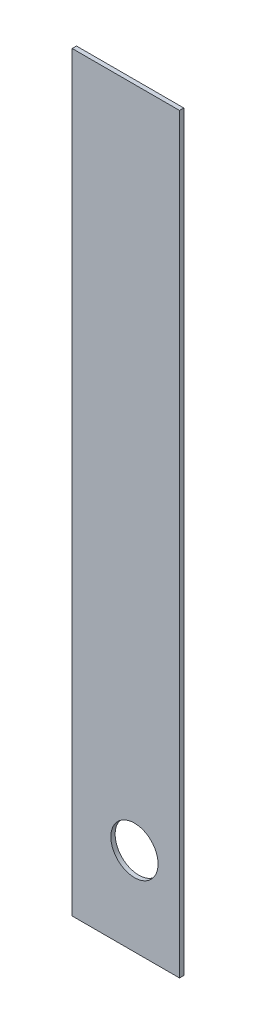
ISO-10303-21;
HEADER;
FILE_DESCRIPTION(('STEP AP214'),'2;1');
FILE_NAME('part.step','',(''),(''),'','','');
FILE_SCHEMA(('AUTOMOTIVE_DESIGN { 1 0 10303 214 1 1 1 1 }'));
ENDSEC;
DATA;
#1=APPLICATION_CONTEXT('core data for automotive mechanical design processes');
#2=APPLICATION_PROTOCOL_DEFINITION('international standard','automotive_design',2000,#1);
#3=PRODUCT_CONTEXT('',#1,'mechanical');
#4=PRODUCT('Part','Part','',(#3));
#5=PRODUCT_RELATED_PRODUCT_CATEGORY('part','',(#4));
#6=PRODUCT_DEFINITION_FORMATION('','',#4);
#7=PRODUCT_DEFINITION_CONTEXT('part definition',#1,'design');
#8=PRODUCT_DEFINITION('design','',#6,#7);
#9=PRODUCT_DEFINITION_SHAPE('','',#8);
#10=(LENGTH_UNIT() NAMED_UNIT(*) SI_UNIT(.MILLI.,.METRE.));
#11=(NAMED_UNIT(*) PLANE_ANGLE_UNIT() SI_UNIT($,.RADIAN.));
#12=(NAMED_UNIT(*) SI_UNIT($,.STERADIAN.) SOLID_ANGLE_UNIT());
#13=UNCERTAINTY_MEASURE_WITH_UNIT(LENGTH_MEASURE(1.E-05),#10,'distance_accuracy_value','');
#14=(GEOMETRIC_REPRESENTATION_CONTEXT(3) GLOBAL_UNCERTAINTY_ASSIGNED_CONTEXT((#13)) GLOBAL_UNIT_ASSIGNED_CONTEXT((#10,
#11,#12)) REPRESENTATION_CONTEXT('',''));
#15=CARTESIAN_POINT('',(0.,0.,0.));
#16=DIRECTION('',(0.,0.,1.));
#17=DIRECTION('',(1.,0.,0.));
#18=AXIS2_PLACEMENT_3D('',#15,#16,#17);
#19=CARTESIAN_POINT('',(-25.,-200.039984012787,1.));
#20=DIRECTION('',(-1.,0.,0.));
#21=DIRECTION('',(0.,0.,1.));
#22=AXIS2_PLACEMENT_3D('',#19,#20,#21);
#23=PLANE('',#22);
#24=DIRECTION('',(0.,0.,-1.));
#25=VECTOR('',#24,1.);
#26=CARTESIAN_POINT('',(-25.,-150.,0.999999999999988));
#27=LINE('',#26,#25);
#28=CARTESIAN_POINT('',(-25.,-150.,1.00000000000001));
#29=VERTEX_POINT('',#28);
#30=CARTESIAN_POINT('',(-25.,-150.,-0.999999999999997));
#31=VERTEX_POINT('',#30);
#32=EDGE_CURVE('E78',#29,#31,#27,.T.);
#33=ORIENTED_EDGE('',*,*,#32,.F.);
#34=DIRECTION('',(0.,1.,0.));
#35=VECTOR('',#34,1.);
#36=CARTESIAN_POINT('',(-25.,-200.039984012787,1.));
#37=LINE('',#36,#35);
#38=CARTESIAN_POINT('',(-25.,200.,1.));
#39=VERTEX_POINT('',#38);
#40=EDGE_CURVE('E73',#29,#39,#37,.T.);
#41=ORIENTED_EDGE('',*,*,#40,.T.);
#42=DIRECTION('',(0.,0.,1.));
#43=VECTOR('',#42,1.);
#44=CARTESIAN_POINT('',(-25.,200.,1.));
#45=LINE('',#44,#43);
#46=CARTESIAN_POINT('',(-25.,200.,-0.999999999999997));
#47=VERTEX_POINT('',#46);
#48=EDGE_CURVE('E77',#47,#39,#45,.T.);
#49=ORIENTED_EDGE('',*,*,#48,.F.);
#50=DIRECTION('',(0.,1.,0.));
#51=VECTOR('',#50,1.);
#52=CARTESIAN_POINT('',(-25.,-200.039984012787,-0.999999999999997));
#53=LINE('',#52,#51);
#54=EDGE_CURVE('E80',#31,#47,#53,.T.);
#55=ORIENTED_EDGE('',*,*,#54,.F.);
#56=EDGE_LOOP('',(#33,#41,#49,#55));
#57=FACE_BOUND('',#56,.T.);
#58=ADVANCED_FACE('F37',(#57),#23,.T.);
#59=CARTESIAN_POINT('',(25.,-200.039984012787,-1.));
#60=DIRECTION('',(0.,0.,-1.));
#61=DIRECTION('',(-1.,0.,0.));
#62=AXIS2_PLACEMENT_3D('',#59,#60,#61);
#63=PLANE('',#62);
#64=CARTESIAN_POINT('',(3.99999999999998,-109.,-1.));
#65=DIRECTION('',(0.,0.,-1.));
#66=DIRECTION('',(-1.,0.,0.));
#67=AXIS2_PLACEMENT_3D('',#64,#65,#66);
#68=CIRCLE('',#67,11.);
#69=CARTESIAN_POINT('',(-7.00000000000002,-109.,-1.));
#70=VERTEX_POINT('',#69);
#71=EDGE_CURVE('E99',#70,#70,#68,.T.);
#72=ORIENTED_EDGE('',*,*,#71,.F.);
#73=EDGE_LOOP('',(#72));
#74=FACE_BOUND('',#73,.T.);
#75=DIRECTION('',(1.,0.,0.));
#76=VECTOR('',#75,1.);
#77=CARTESIAN_POINT('',(25.,-150.,-1.));
#78=LINE('',#77,#76);
#79=CARTESIAN_POINT('',(25.,-150.,-1.));
#80=VERTEX_POINT('',#79);
#81=EDGE_CURVE('E109',#31,#80,#78,.T.);
#82=ORIENTED_EDGE('',*,*,#81,.F.);
#83=ORIENTED_EDGE('',*,*,#54,.T.);
#84=DIRECTION('',(-1.,0.,0.));
#85=VECTOR('',#84,1.);
#86=CARTESIAN_POINT('',(25.,200.,-1.));
#87=LINE('',#86,#85);
#88=CARTESIAN_POINT('',(25.,200.,-1.));
#89=VERTEX_POINT('',#88);
#90=EDGE_CURVE('E81',#89,#47,#87,.T.);
#91=ORIENTED_EDGE('',*,*,#90,.F.);
#92=DIRECTION('',(0.,1.,0.));
#93=VECTOR('',#92,1.);
#94=CARTESIAN_POINT('',(25.,-200.039984012787,-1.));
#95=LINE('',#94,#93);
#96=EDGE_CURVE('E106',#80,#89,#95,.T.);
#97=ORIENTED_EDGE('',*,*,#96,.F.);
#98=EDGE_LOOP('',(#82,#83,#91,#97));
#99=FACE_BOUND('',#98,.T.);
#100=ADVANCED_FACE('F116',(#74,#99),#63,.T.);
#101=CARTESIAN_POINT('',(25.,-200.039984012787,0.999999999999996));
#102=DIRECTION('',(1.,0.,0.));
#103=DIRECTION('',(0.,0.,-1.));
#104=AXIS2_PLACEMENT_3D('',#101,#102,#103);
#105=PLANE('',#104);
#106=DIRECTION('',(0.,0.,1.));
#107=VECTOR('',#106,1.);
#108=CARTESIAN_POINT('',(25.,-150.,0.999999999999981));
#109=LINE('',#108,#107);
#110=CARTESIAN_POINT('',(25.,-150.,0.999999999999996));
#111=VERTEX_POINT('',#110);
#112=EDGE_CURVE('E41',#80,#111,#109,.T.);
#113=ORIENTED_EDGE('',*,*,#112,.F.);
#114=ORIENTED_EDGE('',*,*,#96,.T.);
#115=DIRECTION('',(0.,0.,-1.));
#116=VECTOR('',#115,1.);
#117=CARTESIAN_POINT('',(25.,200.,0.999999999999996));
#118=LINE('',#117,#116);
#119=CARTESIAN_POINT('',(25.,200.,0.999999999999996));
#120=VERTEX_POINT('',#119);
#121=EDGE_CURVE('E91',#120,#89,#118,.T.);
#122=ORIENTED_EDGE('',*,*,#121,.F.);
#123=DIRECTION('',(0.,1.,0.));
#124=VECTOR('',#123,1.);
#125=CARTESIAN_POINT('',(25.,-200.039984012787,0.999999999999996));
#126=LINE('',#125,#124);
#127=EDGE_CURVE('E87',#111,#120,#126,.T.);
#128=ORIENTED_EDGE('',*,*,#127,.F.);
#129=EDGE_LOOP('',(#113,#114,#122,#128));
#130=FACE_BOUND('',#129,.T.);
#131=ADVANCED_FACE('F114',(#130),#105,.T.);
#132=CARTESIAN_POINT('',(25.,-200.039984012787,0.999999999999996));
#133=DIRECTION('',(0.,0.,1.));
#134=DIRECTION('',(1.,0.,0.));
#135=AXIS2_PLACEMENT_3D('',#132,#133,#134);
#136=PLANE('',#135);
#137=CARTESIAN_POINT('',(3.99999999999998,-109.,1.00000000000001));
#138=DIRECTION('',(0.,0.,-1.));
#139=DIRECTION('',(-1.,0.,0.));
#140=AXIS2_PLACEMENT_3D('',#137,#138,#139);
#141=CIRCLE('',#140,11.);
#142=CARTESIAN_POINT('',(-7.00000000000002,-109.,1.00000000000002));
#143=VERTEX_POINT('',#142);
#144=EDGE_CURVE('E96',#143,#143,#141,.T.);
#145=ORIENTED_EDGE('',*,*,#144,.T.);
#146=EDGE_LOOP('',(#145));
#147=FACE_BOUND('',#146,.T.);
#148=DIRECTION('',(-1.,0.,0.));
#149=VECTOR('',#148,1.);
#150=CARTESIAN_POINT('',(25.,-150.,0.999999999999996));
#151=LINE('',#150,#149);
#152=EDGE_CURVE('E11',#111,#29,#151,.T.);
#153=ORIENTED_EDGE('',*,*,#152,.F.);
#154=ORIENTED_EDGE('',*,*,#127,.T.);
#155=DIRECTION('',(1.,0.,0.));
#156=VECTOR('',#155,1.);
#157=CARTESIAN_POINT('',(25.,200.,0.999999999999996));
#158=LINE('',#157,#156);
#159=EDGE_CURVE('E84',#39,#120,#158,.T.);
#160=ORIENTED_EDGE('',*,*,#159,.F.);
#161=ORIENTED_EDGE('',*,*,#40,.F.);
#162=EDGE_LOOP('',(#153,#154,#160,#161));
#163=FACE_BOUND('',#162,.T.);
#164=ADVANCED_FACE('F85',(#147,#163),#136,.T.);
#165=CARTESIAN_POINT('',(-305.802859730683,-150.,1.00000000000005));
#166=DIRECTION('',(0.,1.,0.));
#167=DIRECTION('',(1.,0.,0.));
#168=AXIS2_PLACEMENT_3D('',#165,#166,#167);
#169=PLANE('',#168);
#170=ORIENTED_EDGE('',*,*,#32,.T.);
#171=ORIENTED_EDGE('',*,*,#81,.T.);
#172=ORIENTED_EDGE('',*,*,#112,.T.);
#173=ORIENTED_EDGE('',*,*,#152,.T.);
#174=EDGE_LOOP('',(#170,#171,#172,#173));
#175=FACE_BOUND('',#174,.T.);
#176=ADVANCED_FACE('F39',(#175),#169,.F.);
#177=CARTESIAN_POINT('',(0.,200.,0.));
#178=DIRECTION('',(0.,1.,0.));
#179=DIRECTION('',(0.,0.,1.));
#180=AXIS2_PLACEMENT_3D('',#177,#178,#179);
#181=PLANE('',#180);
#182=ORIENTED_EDGE('',*,*,#48,.T.);
#183=ORIENTED_EDGE('',*,*,#159,.T.);
#184=ORIENTED_EDGE('',*,*,#121,.T.);
#185=ORIENTED_EDGE('',*,*,#90,.T.);
#186=EDGE_LOOP('',(#182,#183,#184,#185));
#187=FACE_BOUND('',#186,.T.);
#188=ADVANCED_FACE('F94',(#187),#181,.T.);
#189=CARTESIAN_POINT('',(3.99999999999998,-109.,1.00000000000001));
#190=DIRECTION('',(0.,0.,-1.));
#191=DIRECTION('',(-1.,0.,0.));
#192=AXIS2_PLACEMENT_3D('',#189,#190,#191);
#193=CYLINDRICAL_SURFACE('',#192,11.);
#194=ORIENTED_EDGE('',*,*,#144,.F.);
#195=EDGE_LOOP('',(#194));
#196=FACE_BOUND('',#195,.T.);
#197=ORIENTED_EDGE('',*,*,#71,.T.);
#198=EDGE_LOOP('',(#197));
#199=FACE_BOUND('',#198,.T.);
#200=ADVANCED_FACE('F132',(#196,#199),#193,.F.);
#201=CLOSED_SHELL('',(#58,#100,#131,#164,#176,#188,#200));
#202=MANIFOLD_SOLID_BREP('B2',#201);
#203=ADVANCED_BREP_SHAPE_REPRESENTATION('',(#18,#202),#14);
#204=SHAPE_DEFINITION_REPRESENTATION(#9,#203);
ENDSEC;
END-ISO-10303-21;
